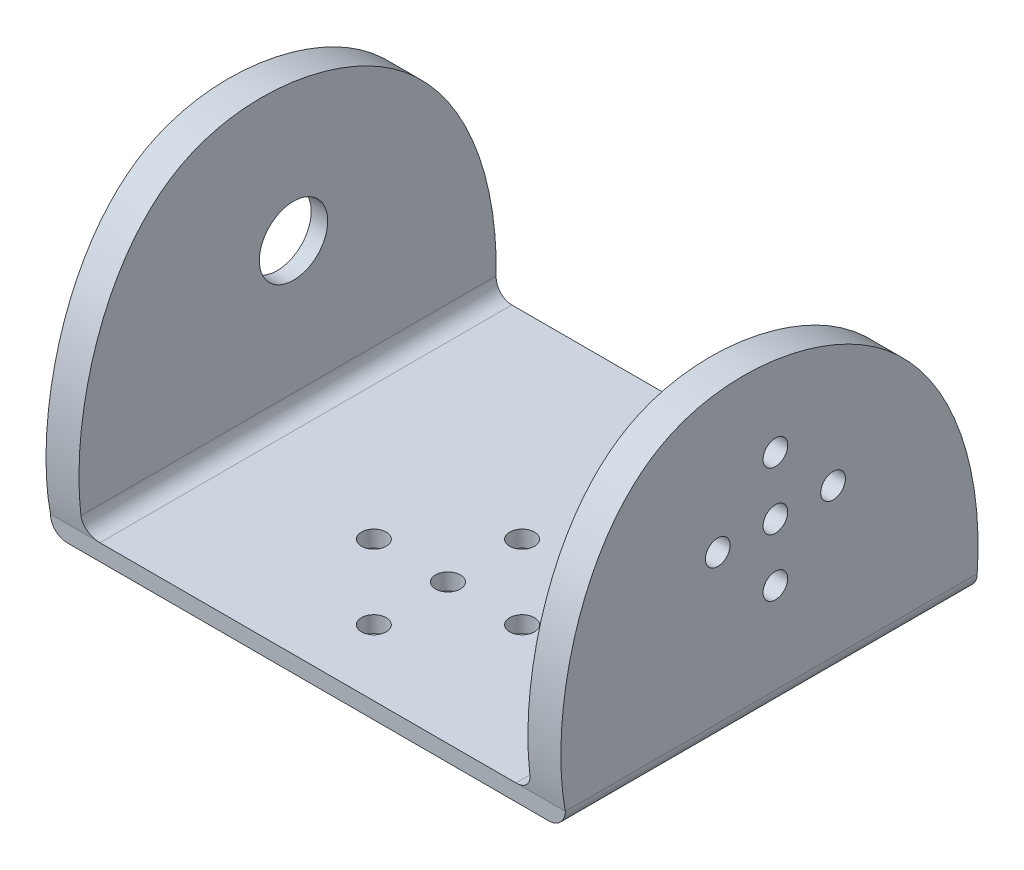
ISO-10303-21;
HEADER;
FILE_DESCRIPTION(('STEP AP214'),'2;1');
FILE_NAME('part.step','',(''),(''),'','','');
FILE_SCHEMA(('AUTOMOTIVE_DESIGN { 1 0 10303 214 1 1 1 1 }'));
ENDSEC;
DATA;
#1=APPLICATION_CONTEXT('core data for automotive mechanical design processes');
#2=APPLICATION_PROTOCOL_DEFINITION('international standard','automotive_design',2000,#1);
#3=PRODUCT_CONTEXT('',#1,'mechanical');
#4=PRODUCT('Part','Part','',(#3));
#5=PRODUCT_RELATED_PRODUCT_CATEGORY('part','',(#4));
#6=PRODUCT_DEFINITION_FORMATION('','',#4);
#7=PRODUCT_DEFINITION_CONTEXT('part definition',#1,'design');
#8=PRODUCT_DEFINITION('design','',#6,#7);
#9=PRODUCT_DEFINITION_SHAPE('','',#8);
#10=(LENGTH_UNIT() NAMED_UNIT(*) SI_UNIT(.MILLI.,.METRE.));
#11=(NAMED_UNIT(*) PLANE_ANGLE_UNIT() SI_UNIT($,.RADIAN.));
#12=(NAMED_UNIT(*) SI_UNIT($,.STERADIAN.) SOLID_ANGLE_UNIT());
#13=UNCERTAINTY_MEASURE_WITH_UNIT(LENGTH_MEASURE(1.E-05),#10,'distance_accuracy_value','');
#14=(GEOMETRIC_REPRESENTATION_CONTEXT(3) GLOBAL_UNCERTAINTY_ASSIGNED_CONTEXT((#13)) GLOBAL_UNIT_ASSIGNED_CONTEXT((#10,
#11,#12)) REPRESENTATION_CONTEXT('',''));
#15=CARTESIAN_POINT('',(0.,0.,0.));
#16=DIRECTION('',(0.,0.,1.));
#17=DIRECTION('',(1.,0.,0.));
#18=AXIS2_PLACEMENT_3D('',#15,#16,#17);
#19=CARTESIAN_POINT('',(-21.25,20.,-0.500000000000001));
#20=DIRECTION('',(-1.,0.,0.));
#21=DIRECTION('',(0.,0.,-1.));
#22=AXIS2_PLACEMENT_3D('',#19,#20,#21);
#23=CYLINDRICAL_SURFACE('',#22,4.15);
#24=CARTESIAN_POINT('',(-27.25,20.,-0.500000000000001));
#25=DIRECTION('',(1.,0.,0.));
#26=DIRECTION('',(0.,0.,-1.));
#27=AXIS2_PLACEMENT_3D('',#24,#25,#26);
#28=CIRCLE('',#27,4.15);
#29=CARTESIAN_POINT('',(-27.25,20.,-4.65));
#30=VERTEX_POINT('',#29);
#31=EDGE_CURVE('E344',#30,#30,#28,.T.);
#32=ORIENTED_EDGE('',*,*,#31,.T.);
#33=EDGE_LOOP('',(#32));
#34=FACE_BOUND('',#33,.T.);
#35=CARTESIAN_POINT('',(-29.25,20.,-0.500000000000001));
#36=DIRECTION('',(1.,0.,0.));
#37=DIRECTION('',(0.,0.,-1.));
#38=AXIS2_PLACEMENT_3D('',#35,#36,#37);
#39=CIRCLE('',#38,4.15);
#40=CARTESIAN_POINT('',(-29.25,20.,-4.65));
#41=VERTEX_POINT('',#40);
#42=EDGE_CURVE('E39',#41,#41,#39,.F.);
#43=ORIENTED_EDGE('',*,*,#42,.T.);
#44=EDGE_LOOP('',(#43));
#45=FACE_BOUND('',#44,.T.);
#46=ADVANCED_FACE('F35',(#34,#45),#23,.F.);
#47=CARTESIAN_POINT('',(0.,2.,0.));
#48=DIRECTION('',(0.,-1.,0.));
#49=DIRECTION('',(0.,0.,1.));
#50=AXIS2_PLACEMENT_3D('',#47,#48,#49);
#51=PLANE('',#50);
#52=CARTESIAN_POINT('',(0.,2.,8.));
#53=DIRECTION('',(0.,-1.,0.));
#54=DIRECTION('',(0.,0.,-1.));
#55=AXIS2_PLACEMENT_3D('',#52,#53,#54);
#56=CIRCLE('',#55,1.5);
#57=CARTESIAN_POINT('',(0.,2.,6.5));
#58=VERTEX_POINT('',#57);
#59=EDGE_CURVE('E345',#58,#58,#56,.T.);
#60=ORIENTED_EDGE('',*,*,#59,.T.);
#61=EDGE_LOOP('',(#60));
#62=FACE_BOUND('',#61,.T.);
#63=CARTESIAN_POINT('',(9.,2.,8.));
#64=DIRECTION('',(0.,-1.,0.));
#65=DIRECTION('',(0.,0.,-1.));
#66=AXIS2_PLACEMENT_3D('',#63,#64,#65);
#67=CIRCLE('',#66,1.49999999999999);
#68=CARTESIAN_POINT('',(9.,2.,6.50000000000001));
#69=VERTEX_POINT('',#68);
#70=EDGE_CURVE('E348',#69,#69,#67,.T.);
#71=ORIENTED_EDGE('',*,*,#70,.T.);
#72=EDGE_LOOP('',(#71));
#73=FACE_BOUND('',#72,.T.);
#74=CARTESIAN_POINT('',(-9.,2.,8.));
#75=DIRECTION('',(0.,-1.,0.));
#76=DIRECTION('',(0.,0.,-1.));
#77=AXIS2_PLACEMENT_3D('',#74,#75,#76);
#78=CIRCLE('',#77,1.5);
#79=CARTESIAN_POINT('',(-9.,2.,6.5));
#80=VERTEX_POINT('',#79);
#81=EDGE_CURVE('E362',#80,#80,#78,.T.);
#82=ORIENTED_EDGE('',*,*,#81,.T.);
#83=EDGE_LOOP('',(#82));
#84=FACE_BOUND('',#83,.T.);
#85=CARTESIAN_POINT('',(0.,2.,-0.999999999999999));
#86=DIRECTION('',(0.,-1.,0.));
#87=DIRECTION('',(0.,0.,-1.));
#88=AXIS2_PLACEMENT_3D('',#85,#86,#87);
#89=CIRCLE('',#88,1.5);
#90=CARTESIAN_POINT('',(0.,2.,-2.5));
#91=VERTEX_POINT('',#90);
#92=EDGE_CURVE('E336',#91,#91,#89,.T.);
#93=ORIENTED_EDGE('',*,*,#92,.T.);
#94=EDGE_LOOP('',(#93));
#95=FACE_BOUND('',#94,.T.);
#96=CARTESIAN_POINT('',(0.,2.,17.));
#97=DIRECTION('',(0.,-1.,0.));
#98=DIRECTION('',(0.,0.,-1.));
#99=AXIS2_PLACEMENT_3D('',#96,#97,#98);
#100=CIRCLE('',#99,1.5);
#101=CARTESIAN_POINT('',(0.,2.,15.5));
#102=VERTEX_POINT('',#101);
#103=EDGE_CURVE('E331',#102,#102,#100,.T.);
#104=ORIENTED_EDGE('',*,*,#103,.T.);
#105=EDGE_LOOP('',(#104));
#106=FACE_BOUND('',#105,.T.);
#107=DIRECTION('',(1.,0.,0.));
#108=VECTOR('',#107,1.);
#109=CARTESIAN_POINT('',(-31.25,2.,-25.));
#110=LINE('',#109,#108);
#111=CARTESIAN_POINT('',(-25.25,2.,-25.));
#112=VERTEX_POINT('',#111);
#113=CARTESIAN_POINT('',(25.25,2.,-25.));
#114=VERTEX_POINT('',#113);
#115=EDGE_CURVE('E123',#112,#114,#110,.T.);
#116=ORIENTED_EDGE('',*,*,#115,.F.);
#117=DIRECTION('',(0.,0.,1.));
#118=VECTOR('',#117,1.);
#119=CARTESIAN_POINT('',(-25.25,2.,-25.));
#120=LINE('',#119,#118);
#121=CARTESIAN_POINT('',(-25.25,2.,25.));
#122=VERTEX_POINT('',#121);
#123=EDGE_CURVE('E168',#122,#112,#120,.F.);
#124=ORIENTED_EDGE('',*,*,#123,.F.);
#125=DIRECTION('',(-1.,0.,0.));
#126=VECTOR('',#125,1.);
#127=CARTESIAN_POINT('',(-31.25,2.,25.));
#128=LINE('',#127,#126);
#129=CARTESIAN_POINT('',(25.25,2.,25.));
#130=VERTEX_POINT('',#129);
#131=EDGE_CURVE('E124',#130,#122,#128,.T.);
#132=ORIENTED_EDGE('',*,*,#131,.F.);
#133=DIRECTION('',(0.,0.,1.));
#134=VECTOR('',#133,1.);
#135=CARTESIAN_POINT('',(25.25,2.,25.));
#136=LINE('',#135,#134);
#137=EDGE_CURVE('E185',#114,#130,#136,.T.);
#138=ORIENTED_EDGE('',*,*,#137,.F.);
#139=EDGE_LOOP('',(#116,#124,#132,#138));
#140=FACE_BOUND('',#139,.T.);
#141=ADVANCED_FACE('F183',(#62,#73,#84,#95,#106,#140),#51,.F.);
#142=CARTESIAN_POINT('',(31.25,2.,-25.));
#143=DIRECTION('',(-1.,0.,0.));
#144=DIRECTION('',(0.,0.,-1.));
#145=AXIS2_PLACEMENT_3D('',#142,#143,#144);
#146=PLANE('',#145);
#147=CARTESIAN_POINT('',(31.25,20.,-7.5));
#148=DIRECTION('',(-1.,0.,0.));
#149=DIRECTION('',(0.,0.,1.));
#150=AXIS2_PLACEMENT_3D('',#147,#148,#149);
#151=CIRCLE('',#150,1.5);
#152=CARTESIAN_POINT('',(31.25,20.,-6.));
#153=VERTEX_POINT('',#152);
#154=EDGE_CURVE('E330',#153,#153,#151,.T.);
#155=ORIENTED_EDGE('',*,*,#154,.T.);
#156=EDGE_LOOP('',(#155));
#157=FACE_BOUND('',#156,.T.);
#158=CARTESIAN_POINT('',(31.25,13.,-0.500000000000003));
#159=DIRECTION('',(-1.,0.,0.));
#160=DIRECTION('',(0.,0.,1.));
#161=AXIS2_PLACEMENT_3D('',#158,#159,#160);
#162=CIRCLE('',#161,1.5);
#163=CARTESIAN_POINT('',(31.25,13.,0.999999999999998));
#164=VERTEX_POINT('',#163);
#165=EDGE_CURVE('E370',#164,#164,#162,.T.);
#166=ORIENTED_EDGE('',*,*,#165,.T.);
#167=EDGE_LOOP('',(#166));
#168=FACE_BOUND('',#167,.T.);
#169=CARTESIAN_POINT('',(31.25,20.,6.5));
#170=DIRECTION('',(-1.,0.,0.));
#171=DIRECTION('',(0.,0.,1.));
#172=AXIS2_PLACEMENT_3D('',#169,#170,#171);
#173=CIRCLE('',#172,1.5);
#174=CARTESIAN_POINT('',(31.25,20.,8.));
#175=VERTEX_POINT('',#174);
#176=EDGE_CURVE('E373',#175,#175,#173,.T.);
#177=ORIENTED_EDGE('',*,*,#176,.T.);
#178=EDGE_LOOP('',(#177));
#179=FACE_BOUND('',#178,.T.);
#180=CARTESIAN_POINT('',(31.25,27.,-0.500000000000001));
#181=DIRECTION('',(-1.,0.,0.));
#182=DIRECTION('',(0.,0.,1.));
#183=AXIS2_PLACEMENT_3D('',#180,#181,#182);
#184=CIRCLE('',#183,1.5);
#185=CARTESIAN_POINT('',(31.25,27.,1.));
#186=VERTEX_POINT('',#185);
#187=EDGE_CURVE('E319',#186,#186,#184,.T.);
#188=ORIENTED_EDGE('',*,*,#187,.T.);
#189=EDGE_LOOP('',(#188));
#190=FACE_BOUND('',#189,.T.);
#191=CARTESIAN_POINT('',(31.25,20.,-0.500000000000001));
#192=DIRECTION('',(-1.,0.,0.));
#193=DIRECTION('',(0.,0.,1.));
#194=AXIS2_PLACEMENT_3D('',#191,#192,#193);
#195=CIRCLE('',#194,1.5);
#196=CARTESIAN_POINT('',(31.25,20.,1.));
#197=VERTEX_POINT('',#196);
#198=EDGE_CURVE('E201',#197,#197,#195,.T.);
#199=ORIENTED_EDGE('',*,*,#198,.T.);
#200=EDGE_LOOP('',(#199));
#201=FACE_BOUND('',#200,.T.);
#202=CARTESIAN_POINT('',(31.25,2.,25.));
#203=CARTESIAN_POINT('',(31.25,12.4965732747721,26.9986110399996));
#204=CARTESIAN_POINT('',(31.25,40.5213350472176,21.2250504115053));
#205=CARTESIAN_POINT('',(31.25,35.4925410191959,-18.9148455529088));
#206=CARTESIAN_POINT('',(31.25,13.3222401499654,-25.8185226715894));
#207=CARTESIAN_POINT('',(31.25,2.,-25.));
#208=B_SPLINE_CURVE_WITH_KNOTS('',3,(#202,#203,#204,#205,#206,#207),.UNSPECIFIED.,.F.,.F.,(4,1,
1,4),(0.,0.374548065901029,0.638867123115129,1.),.UNSPECIFIED.);
#209=CARTESIAN_POINT('',(31.25,2.,25.));
#210=VERTEX_POINT('',#209);
#211=CARTESIAN_POINT('',(31.25,2.,-25.));
#212=VERTEX_POINT('',#211);
#213=EDGE_CURVE('E119',#210,#212,#208,.T.);
#214=ORIENTED_EDGE('',*,*,#213,.F.);
#215=DIRECTION('',(0.,0.,1.));
#216=VECTOR('',#215,1.);
#217=CARTESIAN_POINT('',(31.25,2.,25.));
#218=LINE('',#217,#216);
#219=EDGE_CURVE('E127',#212,#210,#218,.T.);
#220=ORIENTED_EDGE('',*,*,#219,.F.);
#221=EDGE_LOOP('',(#214,#220));
#222=FACE_BOUND('',#221,.T.);
#223=ADVANCED_FACE('F133',(#157,#168,#179,#190,#201,#222),#146,.F.);
#224=CARTESIAN_POINT('',(-31.25,2.,25.));
#225=DIRECTION('',(0.,0.,-1.));
#226=DIRECTION('',(1.,0.,0.));
#227=AXIS2_PLACEMENT_3D('',#224,#225,#226);
#228=PLANE('',#227);
#229=EDGE_CURVE('E107',#210,#130,#128,.T.);
#230=ORIENTED_EDGE('',*,*,#229,.T.);
#231=ORIENTED_EDGE('',*,*,#131,.T.);
#232=DIRECTION('',(-1.,0.,0.));
#233=VECTOR('',#232,1.);
#234=CARTESIAN_POINT('',(-27.25,2.,25.));
#235=LINE('',#234,#233);
#236=CARTESIAN_POINT('',(-31.25,2.,25.));
#237=VERTEX_POINT('',#236);
#238=EDGE_CURVE('E135',#122,#237,#235,.T.);
#239=ORIENTED_EDGE('',*,*,#238,.T.);
#240=CARTESIAN_POINT('',(-29.25,2.,25.));
#241=DIRECTION('',(0.,0.,1.));
#242=DIRECTION('',(1.,0.,0.));
#243=AXIS2_PLACEMENT_3D('',#240,#241,#242);
#244=CIRCLE('',#243,2.);
#245=CARTESIAN_POINT('',(-29.25,0.,25.));
#246=VERTEX_POINT('',#245);
#247=EDGE_CURVE('E112',#246,#237,#244,.F.);
#248=ORIENTED_EDGE('',*,*,#247,.F.);
#249=DIRECTION('',(-1.,0.,0.));
#250=VECTOR('',#249,1.);
#251=CARTESIAN_POINT('',(-31.25,0.,25.));
#252=LINE('',#251,#250);
#253=CARTESIAN_POINT('',(29.25,0.,25.));
#254=VERTEX_POINT('',#253);
#255=EDGE_CURVE('E110',#254,#246,#252,.T.);
#256=ORIENTED_EDGE('',*,*,#255,.F.);
#257=CARTESIAN_POINT('',(29.25,2.,25.));
#258=DIRECTION('',(0.,0.,1.));
#259=DIRECTION('',(1.,0.,0.));
#260=AXIS2_PLACEMENT_3D('',#257,#258,#259);
#261=CIRCLE('',#260,2.);
#262=EDGE_CURVE('E103',#210,#254,#261,.F.);
#263=ORIENTED_EDGE('',*,*,#262,.F.);
#264=EDGE_LOOP('',(#230,#231,#239,#248,#256,#263));
#265=FACE_BOUND('',#264,.T.);
#266=ADVANCED_FACE('F105',(#265),#228,.F.);
#267=CARTESIAN_POINT('',(-31.25,2.,-25.));
#268=DIRECTION('',(1.,0.,0.));
#269=DIRECTION('',(0.,0.,1.));
#270=AXIS2_PLACEMENT_3D('',#267,#268,#269);
#271=PLANE('',#270);
#272=CARTESIAN_POINT('',(-31.25,20.,-0.500000000000001));
#273=DIRECTION('',(1.,0.,0.));
#274=DIRECTION('',(0.,0.,-1.));
#275=AXIS2_PLACEMENT_3D('',#272,#273,#274);
#276=CIRCLE('',#275,8.);
#277=CARTESIAN_POINT('',(-31.25,20.,-8.5));
#278=VERTEX_POINT('',#277);
#279=EDGE_CURVE('E354',#278,#278,#276,.T.);
#280=ORIENTED_EDGE('',*,*,#279,.T.);
#281=EDGE_LOOP('',(#280));
#282=FACE_BOUND('',#281,.T.);
#283=CARTESIAN_POINT('',(-31.25,2.,25.));
#284=CARTESIAN_POINT('',(-31.25,12.4965732747721,26.9986110399996));
#285=CARTESIAN_POINT('',(-31.25,40.5213350472176,21.2250504115053));
#286=CARTESIAN_POINT('',(-31.25,35.4925410191959,-18.9148455529088));
#287=CARTESIAN_POINT('',(-31.25,13.3222401499654,-25.8185226715894));
#288=CARTESIAN_POINT('',(-31.25,2.,-25.));
#289=B_SPLINE_CURVE_WITH_KNOTS('',3,(#283,#284,#285,#286,#287,#288),.UNSPECIFIED.,.F.,.F.,(4,1,
1,4),(0.,0.374548065901029,0.638867123115129,1.),.UNSPECIFIED.);
#290=CARTESIAN_POINT('',(-31.25,2.,-25.));
#291=VERTEX_POINT('',#290);
#292=EDGE_CURVE('E195',#237,#291,#289,.T.);
#293=ORIENTED_EDGE('',*,*,#292,.T.);
#294=DIRECTION('',(0.,0.,-1.));
#295=VECTOR('',#294,1.);
#296=CARTESIAN_POINT('',(-31.25,2.,-25.));
#297=LINE('',#296,#295);
#298=EDGE_CURVE('E11',#237,#291,#297,.T.);
#299=ORIENTED_EDGE('',*,*,#298,.F.);
#300=EDGE_LOOP('',(#293,#299));
#301=FACE_BOUND('',#300,.T.);
#302=ADVANCED_FACE('F407',(#282,#301),#271,.F.);
#303=CARTESIAN_POINT('',(-31.25,2.,-25.));
#304=DIRECTION('',(0.,0.,1.));
#305=DIRECTION('',(-1.,0.,0.));
#306=AXIS2_PLACEMENT_3D('',#303,#304,#305);
#307=PLANE('',#306);
#308=DIRECTION('',(1.,0.,0.));
#309=VECTOR('',#308,1.);
#310=CARTESIAN_POINT('',(-31.25,0.,-25.));
#311=LINE('',#310,#309);
#312=CARTESIAN_POINT('',(-29.25,0.,-25.));
#313=VERTEX_POINT('',#312);
#314=CARTESIAN_POINT('',(29.25,0.,-25.));
#315=VERTEX_POINT('',#314);
#316=EDGE_CURVE('E164',#313,#315,#311,.T.);
#317=ORIENTED_EDGE('',*,*,#316,.F.);
#318=CARTESIAN_POINT('',(-29.25,2.,-25.));
#319=DIRECTION('',(0.,0.,-1.));
#320=DIRECTION('',(-1.,0.,0.));
#321=AXIS2_PLACEMENT_3D('',#318,#319,#320);
#322=CIRCLE('',#321,2.);
#323=EDGE_CURVE('E563',#291,#313,#322,.F.);
#324=ORIENTED_EDGE('',*,*,#323,.F.);
#325=EDGE_CURVE('E165',#291,#112,#110,.T.);
#326=ORIENTED_EDGE('',*,*,#325,.T.);
#327=ORIENTED_EDGE('',*,*,#115,.T.);
#328=DIRECTION('',(1.,0.,0.));
#329=VECTOR('',#328,1.);
#330=CARTESIAN_POINT('',(27.25,2.,-25.));
#331=LINE('',#330,#329);
#332=EDGE_CURVE('E138',#114,#212,#331,.T.);
#333=ORIENTED_EDGE('',*,*,#332,.T.);
#334=CARTESIAN_POINT('',(29.25,2.,-25.));
#335=DIRECTION('',(0.,0.,-1.));
#336=DIRECTION('',(-1.,0.,0.));
#337=AXIS2_PLACEMENT_3D('',#334,#335,#336);
#338=CIRCLE('',#337,2.);
#339=EDGE_CURVE('E44',#315,#212,#338,.F.);
#340=ORIENTED_EDGE('',*,*,#339,.F.);
#341=EDGE_LOOP('',(#317,#324,#326,#327,#333,#340));
#342=FACE_BOUND('',#341,.T.);
#343=ADVANCED_FACE('F177',(#342),#307,.F.);
#344=CARTESIAN_POINT('',(0.,0.,0.));
#345=DIRECTION('',(0.,-1.,0.));
#346=DIRECTION('',(0.,0.,1.));
#347=AXIS2_PLACEMENT_3D('',#344,#345,#346);
#348=PLANE('',#347);
#349=CARTESIAN_POINT('',(0.,0.,8.));
#350=DIRECTION('',(0.,1.,0.));
#351=DIRECTION('',(0.,0.,1.));
#352=AXIS2_PLACEMENT_3D('',#349,#350,#351);
#353=CIRCLE('',#352,1.5);
#354=CARTESIAN_POINT('',(0.,0.,9.5));
#355=VERTEX_POINT('',#354);
#356=EDGE_CURVE('E342',#355,#355,#353,.T.);
#357=ORIENTED_EDGE('',*,*,#356,.T.);
#358=EDGE_LOOP('',(#357));
#359=FACE_BOUND('',#358,.T.);
#360=CARTESIAN_POINT('',(9.,0.,8.));
#361=DIRECTION('',(0.,1.,0.));
#362=DIRECTION('',(0.,0.,1.));
#363=AXIS2_PLACEMENT_3D('',#360,#361,#362);
#364=CIRCLE('',#363,1.49999999999999);
#365=CARTESIAN_POINT('',(9.,0.,9.49999999999999));
#366=VERTEX_POINT('',#365);
#367=EDGE_CURVE('E339',#366,#366,#364,.T.);
#368=ORIENTED_EDGE('',*,*,#367,.T.);
#369=EDGE_LOOP('',(#368));
#370=FACE_BOUND('',#369,.T.);
#371=CARTESIAN_POINT('',(-9.,0.,8.));
#372=DIRECTION('',(0.,1.,0.));
#373=DIRECTION('',(0.,0.,1.));
#374=AXIS2_PLACEMENT_3D('',#371,#372,#373);
#375=CIRCLE('',#374,1.5);
#376=CARTESIAN_POINT('',(-9.,0.,9.5));
#377=VERTEX_POINT('',#376);
#378=EDGE_CURVE('E335',#377,#377,#375,.T.);
#379=ORIENTED_EDGE('',*,*,#378,.T.);
#380=EDGE_LOOP('',(#379));
#381=FACE_BOUND('',#380,.T.);
#382=CARTESIAN_POINT('',(0.,0.,-0.999999999999999));
#383=DIRECTION('',(0.,1.,0.));
#384=DIRECTION('',(0.,0.,1.));
#385=AXIS2_PLACEMENT_3D('',#382,#383,#384);
#386=CIRCLE('',#385,1.5);
#387=CARTESIAN_POINT('',(0.,0.,0.500000000000002));
#388=VERTEX_POINT('',#387);
#389=EDGE_CURVE('E332',#388,#388,#386,.T.);
#390=ORIENTED_EDGE('',*,*,#389,.T.);
#391=EDGE_LOOP('',(#390));
#392=FACE_BOUND('',#391,.T.);
#393=CARTESIAN_POINT('',(0.,0.,17.));
#394=DIRECTION('',(0.,1.,0.));
#395=DIRECTION('',(0.,0.,1.));
#396=AXIS2_PLACEMENT_3D('',#393,#394,#395);
#397=CIRCLE('',#396,1.5);
#398=CARTESIAN_POINT('',(0.,0.,18.5));
#399=VERTEX_POINT('',#398);
#400=EDGE_CURVE('E327',#399,#399,#397,.T.);
#401=ORIENTED_EDGE('',*,*,#400,.T.);
#402=EDGE_LOOP('',(#401));
#403=FACE_BOUND('',#402,.T.);
#404=ORIENTED_EDGE('',*,*,#255,.T.);
#405=DIRECTION('',(0.,0.,-1.));
#406=VECTOR('',#405,1.);
#407=CARTESIAN_POINT('',(-29.25,0.,25.));
#408=LINE('',#407,#406);
#409=EDGE_CURVE('E60',#313,#246,#408,.F.);
#410=ORIENTED_EDGE('',*,*,#409,.F.);
#411=ORIENTED_EDGE('',*,*,#316,.T.);
#412=DIRECTION('',(0.,0.,1.));
#413=VECTOR('',#412,1.);
#414=CARTESIAN_POINT('',(29.25,0.,-25.));
#415=LINE('',#414,#413);
#416=EDGE_CURVE('E52',#254,#315,#415,.F.);
#417=ORIENTED_EDGE('',*,*,#416,.F.);
#418=EDGE_LOOP('',(#404,#410,#411,#417));
#419=FACE_BOUND('',#418,.T.);
#420=ADVANCED_FACE('F399',(#359,#370,#381,#392,#403,#419),#348,.T.);
#421=CARTESIAN_POINT('',(27.25,2.,25.));
#422=CARTESIAN_POINT('',(27.25,12.4965732747721,26.9986110399996));
#423=CARTESIAN_POINT('',(27.25,40.5213350472176,21.2250504115053));
#424=CARTESIAN_POINT('',(27.25,35.4925410191959,-18.9148455529088));
#425=CARTESIAN_POINT('',(27.25,13.3222401499654,-25.8185226715894));
#426=CARTESIAN_POINT('',(27.25,2.,-25.));
#427=B_SPLINE_CURVE_WITH_KNOTS('',3,(#421,#422,#423,#424,#425,#426),.UNSPECIFIED.,.F.,.F.,(4,1,
1,4),(0.,0.374548065901029,0.638867123115129,1.),.UNSPECIFIED.);
#428=DIRECTION('',(1.,0.,0.));
#429=VECTOR('',#428,1.);
#430=SURFACE_OF_LINEAR_EXTRUSION('',#427,#429);
#431=ORIENTED_EDGE('',*,*,#213,.T.);
#432=ORIENTED_EDGE('',*,*,#332,.F.);
#433=CARTESIAN_POINT('',(27.25,4.,-25.0940546730837));
#434=CARTESIAN_POINT('',(27.2499996602988,3.94371790823869,-25.0928174416989));
#435=CARTESIAN_POINT('',(27.2476227621191,3.88746553850568,-25.0914613576098));
#436=CARTESIAN_POINT('',(27.2381418971551,3.77536969388625,-25.0885258744203));
#437=CARTESIAN_POINT('',(27.2310381975837,3.71952619606613,-25.0869464879476));
#438=CARTESIAN_POINT('',(27.2027078619535,3.55331307572943,-25.0819004804104));
#439=CARTESIAN_POINT('',(27.1744617833224,3.44406617622991,-25.078121685189));
#440=CARTESIAN_POINT('',(27.1000463326179,3.23189133924249,-25.0699548927492));
#441=CARTESIAN_POINT('',(27.053869078434,3.12896620372471,-25.0655666281684));
#442=CARTESIAN_POINT('',(26.9449088923315,2.93233507965083,-25.0564824892471));
#443=CARTESIAN_POINT('',(26.8821284340264,2.83862772064333,-25.0517866608071));
#444=CARTESIAN_POINT('',(26.7416617335216,2.66298579810713,-25.0424357746962));
#445=CARTESIAN_POINT('',(26.6639600176479,2.58106361168521,-25.0377807646413));
#446=CARTESIAN_POINT('',(26.4958669885989,2.4314089330096,-25.028888436805));
#447=CARTESIAN_POINT('',(26.4054732527391,2.36367915600468,-25.0246511990325));
#448=CARTESIAN_POINT('',(26.2145672147693,2.24435557040868,-25.0169492732739));
#449=CARTESIAN_POINT('',(26.1140539741217,2.19276326031955,-25.0134846570408));
#450=CARTESIAN_POINT('',(25.9057806617175,2.10722286137904,-25.007628227467));
#451=CARTESIAN_POINT('',(25.7980250552955,2.0732640111762,-25.0052357599376));
#452=CARTESIAN_POINT('',(25.6163340698651,2.03245270329474,-25.0023359820987));
#453=CARTESIAN_POINT('',(25.543552911349,2.02029080201167,-25.0014630757466));
#454=CARTESIAN_POINT('',(25.397191542896,2.00406531086475,-25.000293924171));
#455=CARTESIAN_POINT('',(25.3236125836537,1.99999049273825,-24.9999968794234));
#456=CARTESIAN_POINT('',(25.25,2.,-25.));
#457=B_SPLINE_CURVE_WITH_KNOTS('',3,(#433,#434,#435,#436,#437,#438,#439,#440,#441,#442,#443,
#444,#445,#446,#447,#448,#449,#450,#451,#452,#453,#454,#455,#456),.UNSPECIFIED.,.F.,.F.,(4,2,2,
2,2,2,2,2,2,2,2,4),(0.,0.168783026130116,0.337556511523385,0.674526832554655,1.01164544556335,
1.34871386152227,1.68613373117391,2.02361809615281,2.36113379014715,2.69844326219136,
2.91940936905553,3.14006846707721),.UNSPECIFIED.);
#458=CARTESIAN_POINT('',(27.25,3.99999999999898,-25.0940546730837));
#459=VERTEX_POINT('',#458);
#460=EDGE_CURVE('E390',#459,#114,#457,.T.);
#461=ORIENTED_EDGE('',*,*,#460,.F.);
#462=CARTESIAN_POINT('',(27.25,3.99999999999718,25.3073145724767));
#463=VERTEX_POINT('',#462);
#464=EDGE_CURVE('E134',#463,#459,#427,.T.);
#465=ORIENTED_EDGE('',*,*,#464,.F.);
#466=CARTESIAN_POINT('',(25.25,2.,25.));
#467=CARTESIAN_POINT('',(25.3056308472885,1.99999982456958,24.9999989302493));
#468=CARTESIAN_POINT('',(25.3612346927238,2.00232258138537,25.0004423444697));
#469=CARTESIAN_POINT('',(25.4720371476397,2.0115853624888,25.0022039069439));
#470=CARTESIAN_POINT('',(25.5272357954518,2.0185249441836,25.0035219713493));
#471=CARTESIAN_POINT('',(25.6914675227234,2.04618532801374,25.0087590872627));
#472=CARTESIAN_POINT('',(25.7993887718549,2.07374806845775,25.0139611924871));
#473=CARTESIAN_POINT('',(26.0089696358096,2.14627861323213,25.0274582520252));
#474=CARTESIAN_POINT('',(26.1106276831846,2.1912507541476,25.0357539769236));
#475=CARTESIAN_POINT('',(26.3049364192619,2.29725182035756,25.0549305356204));
#476=CARTESIAN_POINT('',(26.3975869850039,2.35828096480246,25.0658114047014));
#477=CARTESIAN_POINT('',(26.5722023950081,2.49526999989428,25.0896467580208));
#478=CARTESIAN_POINT('',(26.6540598744528,2.57136343945371,25.1026195819123));
#479=CARTESIAN_POINT('',(26.8039134794138,2.73598106119919,25.1298738261535));
#480=CARTESIAN_POINT('',(26.8719062758284,2.82450822029571,25.1441555596));
#481=CARTESIAN_POINT('',(26.9931070428983,3.01292659727219,25.1735476861525));
#482=CARTESIAN_POINT('',(27.0460814910199,3.1129665153829,25.1886672106529));
#483=CARTESIAN_POINT('',(27.1344136154236,3.32052278078583,25.2188616726429));
#484=CARTESIAN_POINT('',(27.1697804084676,3.42803522607575,25.2339366291807));
#485=CARTESIAN_POINT('',(27.2138203997309,3.61339235163513,25.2588681236007));
#486=CARTESIAN_POINT('',(27.2273711970838,3.69009171347356,25.268892509345));
#487=CARTESIAN_POINT('',(27.2454614467239,3.84450441001522,25.2884807891499));
#488=CARTESIAN_POINT('',(27.250012134452,3.9222163584259,25.298045242795));
#489=CARTESIAN_POINT('',(27.25,3.99999999999996,25.307314572477));
#490=B_SPLINE_CURVE_WITH_KNOTS('',3,(#466,#467,#468,#469,#470,#471,#472,#473,#474,#475,#476,
#477,#478,#479,#480,#481,#482,#483,#484,#485,#486,#487,#488,#489),.UNSPECIFIED.,.F.,.F.,(4,2,2,
2,2,2,2,2,2,2,2,4),(0.,0.166788867778222,0.333561748611818,0.666360093928348,0.999241390864281,
1.33212723129139,1.66810821952952,2.00416978669031,2.34520134302898,2.68605613844457,
2.92115037932767,3.155950950578),.UNSPECIFIED.);
#491=EDGE_CURVE('E122',#130,#463,#490,.T.);
#492=ORIENTED_EDGE('',*,*,#491,.F.);
#493=ORIENTED_EDGE('',*,*,#229,.F.);
#494=EDGE_LOOP('',(#431,#432,#461,#465,#492,#493));
#495=FACE_BOUND('',#494,.T.);
#496=ADVANCED_FACE('F116',(#495),#430,.F.);
#497=CARTESIAN_POINT('',(27.25,36.9357221086631,1.54790967486696));
#498=DIRECTION('',(1.,0.,0.));
#499=DIRECTION('',(0.,0.,1.));
#500=AXIS2_PLACEMENT_3D('',#497,#498,#499);
#501=PLANE('',#500);
#502=CARTESIAN_POINT('',(27.25,20.,-7.5));
#503=DIRECTION('',(-1.,0.,0.));
#504=DIRECTION('',(0.,0.,1.));
#505=AXIS2_PLACEMENT_3D('',#502,#503,#504);
#506=CIRCLE('',#505,1.5);
#507=CARTESIAN_POINT('',(27.25,20.,-6.));
#508=VERTEX_POINT('',#507);
#509=EDGE_CURVE('E312',#508,#508,#506,.T.);
#510=ORIENTED_EDGE('',*,*,#509,.F.);
#511=EDGE_LOOP('',(#510));
#512=FACE_BOUND('',#511,.T.);
#513=CARTESIAN_POINT('',(27.25,13.,-0.500000000000003));
#514=DIRECTION('',(-1.,0.,0.));
#515=DIRECTION('',(0.,0.,1.));
#516=AXIS2_PLACEMENT_3D('',#513,#514,#515);
#517=CIRCLE('',#516,1.5);
#518=CARTESIAN_POINT('',(27.25,13.,0.999999999999998));
#519=VERTEX_POINT('',#518);
#520=EDGE_CURVE('E322',#519,#519,#517,.T.);
#521=ORIENTED_EDGE('',*,*,#520,.F.);
#522=EDGE_LOOP('',(#521));
#523=FACE_BOUND('',#522,.T.);
#524=CARTESIAN_POINT('',(27.25,20.,6.5));
#525=DIRECTION('',(-1.,0.,0.));
#526=DIRECTION('',(0.,0.,1.));
#527=AXIS2_PLACEMENT_3D('',#524,#525,#526);
#528=CIRCLE('',#527,1.5);
#529=CARTESIAN_POINT('',(27.25,20.,8.));
#530=VERTEX_POINT('',#529);
#531=EDGE_CURVE('E318',#530,#530,#528,.T.);
#532=ORIENTED_EDGE('',*,*,#531,.F.);
#533=EDGE_LOOP('',(#532));
#534=FACE_BOUND('',#533,.T.);
#535=CARTESIAN_POINT('',(27.25,27.,-0.500000000000001));
#536=DIRECTION('',(-1.,0.,0.));
#537=DIRECTION('',(0.,0.,1.));
#538=AXIS2_PLACEMENT_3D('',#535,#536,#537);
#539=CIRCLE('',#538,1.5);
#540=CARTESIAN_POINT('',(27.25,27.,1.));
#541=VERTEX_POINT('',#540);
#542=EDGE_CURVE('E315',#541,#541,#539,.T.);
#543=ORIENTED_EDGE('',*,*,#542,.F.);
#544=EDGE_LOOP('',(#543));
#545=FACE_BOUND('',#544,.T.);
#546=CARTESIAN_POINT('',(27.25,20.,-0.500000000000001));
#547=DIRECTION('',(-1.,0.,0.));
#548=DIRECTION('',(0.,0.,1.));
#549=AXIS2_PLACEMENT_3D('',#546,#547,#548);
#550=CIRCLE('',#549,1.5);
#551=CARTESIAN_POINT('',(27.25,20.,1.));
#552=VERTEX_POINT('',#551);
#553=EDGE_CURVE('E308',#552,#552,#550,.T.);
#554=ORIENTED_EDGE('',*,*,#553,.F.);
#555=EDGE_LOOP('',(#554));
#556=FACE_BOUND('',#555,.T.);
#557=ORIENTED_EDGE('',*,*,#464,.T.);
#558=DIRECTION('',(0.,0.,1.));
#559=VECTOR('',#558,1.);
#560=CARTESIAN_POINT('',(27.25,4.,-25.));
#561=LINE('',#560,#559);
#562=EDGE_CURVE('E187',#463,#459,#561,.F.);
#563=ORIENTED_EDGE('',*,*,#562,.F.);
#564=EDGE_LOOP('',(#557,#563));
#565=FACE_BOUND('',#564,.T.);
#566=ADVANCED_FACE('F216',(#512,#523,#534,#545,#556,#565),#501,.F.);
#567=CARTESIAN_POINT('',(-27.25,2.,25.));
#568=CARTESIAN_POINT('',(-27.25,12.4965732747721,26.9986110399996));
#569=CARTESIAN_POINT('',(-27.25,40.5213350472176,21.2250504115053));
#570=CARTESIAN_POINT('',(-27.25,35.4925410191959,-18.9148455529088));
#571=CARTESIAN_POINT('',(-27.25,13.3222401499654,-25.8185226715894));
#572=CARTESIAN_POINT('',(-27.25,2.,-25.));
#573=B_SPLINE_CURVE_WITH_KNOTS('',3,(#567,#568,#569,#570,#571,#572),.UNSPECIFIED.,.F.,.F.,(4,1,
1,4),(0.,0.374548065901029,0.638867123115129,1.),.UNSPECIFIED.);
#574=DIRECTION('',(-1.,0.,0.));
#575=VECTOR('',#574,1.);
#576=SURFACE_OF_LINEAR_EXTRUSION('',#573,#575);
#577=ORIENTED_EDGE('',*,*,#292,.F.);
#578=ORIENTED_EDGE('',*,*,#238,.F.);
#579=CARTESIAN_POINT('',(-27.25,4.,25.3073145724767));
#580=CARTESIAN_POINT('',(-27.2499995002997,3.9432188202566,25.3005454568416));
#581=CARTESIAN_POINT('',(-27.2475804814018,3.88648416921429,25.2936232287081));
#582=CARTESIAN_POINT('',(-27.2379386596122,3.77346116439942,25.2795202145534));
#583=CARTESIAN_POINT('',(-27.2307162121404,3.71717277791824,25.2723394476993));
#584=CARTESIAN_POINT('',(-27.2019249077835,3.54967943743015,25.2505034412767));
#585=CARTESIAN_POINT('',(-27.1732318418591,3.43965579157005,25.2355317458476));
#586=CARTESIAN_POINT('',(-27.0976797601208,3.22609321823963,25.2053199420493));
#587=CARTESIAN_POINT('',(-27.0508142436986,3.12255662671628,25.1900797394947));
#588=CARTESIAN_POINT('',(-26.9402284204148,2.92484993903057,25.1599807106084));
#589=CARTESIAN_POINT('',(-26.8765101872144,2.8306786924592,25.1451218376022));
#590=CARTESIAN_POINT('',(-26.7338823557517,2.65427493583318,25.1164887617195));
#591=CARTESIAN_POINT('',(-26.6549557590029,2.57205596703485,25.1027157970739));
#592=CARTESIAN_POINT('',(-26.4841063330172,2.42205792844871,25.0770133301472));
#593=CARTESIAN_POINT('',(-26.3921814667145,2.35428112619353,25.0650841174302));
#594=CARTESIAN_POINT('',(-26.1987496339054,2.23573237380891,25.0438665160381));
#595=CARTESIAN_POINT('',(-26.0973288031976,2.18482356430833,25.0345569706041));
#596=CARTESIAN_POINT('',(-25.8871694049093,2.10084404547307,25.0190362384581));
#597=CARTESIAN_POINT('',(-25.7784368389628,2.06775890234706,25.0128225450002));
#598=CARTESIAN_POINT('',(-25.5990879110527,2.02944853506958,25.0055942513628));
#599=CARTESIAN_POINT('',(-25.5297022313551,2.01841319509346,25.0035011054154));
#600=CARTESIAN_POINT('',(-25.3902220182764,2.00368992081983,25.000702651112));
#601=CARTESIAN_POINT('',(-25.3201285536048,1.99999220780713,24.9999954956885));
#602=CARTESIAN_POINT('',(-25.25,2.,25.));
#603=B_SPLINE_CURVE_WITH_KNOTS('',3,(#579,#580,#581,#582,#583,#584,#585,#586,#587,#588,#589,
#590,#591,#592,#593,#594,#595,#596,#597,#598,#599,#600,#601,#602),.UNSPECIFIED.,.F.,.F.,(4,2,2,
2,2,2,2,2,2,2,2,4),(0.,0.171443016861837,0.342873349561651,0.685165765921442,1.02758073948382,
1.36995359979932,1.71271137576664,2.05552292778561,2.39548076168655,2.73516287875798,
2.94566014372603,3.15587669410919),.UNSPECIFIED.);
#604=CARTESIAN_POINT('',(-27.25,3.99999999999718,25.3073145724767));
#605=VERTEX_POINT('',#604);
#606=EDGE_CURVE('E222',#605,#122,#603,.T.);
#607=ORIENTED_EDGE('',*,*,#606,.F.);
#608=CARTESIAN_POINT('',(-27.25,3.99999999999902,-25.0940546730837));
#609=VERTEX_POINT('',#608);
#610=EDGE_CURVE('E141',#605,#609,#573,.T.);
#611=ORIENTED_EDGE('',*,*,#610,.T.);
#612=CARTESIAN_POINT('',(-25.25,2.,-25.));
#613=CARTESIAN_POINT('',(-25.306183866871,2.00000028946752,-24.9999993255992));
#614=CARTESIAN_POINT('',(-25.3623407565232,2.00236895897048,-25.0001713375267));
#615=CARTESIAN_POINT('',(-25.4742514226067,2.01181798663403,-25.0008529991588));
#616=CARTESIAN_POINT('',(-25.5300052215649,2.01889807940492,-25.0013626298457));
#617=CARTESIAN_POINT('',(-25.6959541835105,2.04713534341397,-25.0033840200909));
#618=CARTESIAN_POINT('',(-25.8050357601797,2.07528970437356,-25.0053883315066));
#619=CARTESIAN_POINT('',(-26.0169061052239,2.1494659694081,-25.0105376635655));
#620=CARTESIAN_POINT('',(-26.119692079986,2.1954957399705,-25.0136831863851));
#621=CARTESIAN_POINT('',(-26.316076792718,2.3041044437466,-25.0208431856252));
#622=CARTESIAN_POINT('',(-26.4096768294993,2.36668103274916,-25.0248575389426));
#623=CARTESIAN_POINT('',(-26.5851889418282,2.50671620674585,-25.0334251255028));
#624=CARTESIAN_POINT('',(-26.6670830904327,2.58419720028724,-25.0379791661481));
#625=CARTESIAN_POINT('',(-26.8167298948204,2.75180954361902,-25.0472530395619));
#626=CARTESIAN_POINT('',(-26.8844797121952,2.84194342646572,-25.0519729053858));
#627=CARTESIAN_POINT('',(-27.0040167794761,3.03247627853211,-25.0612230467341));
#628=CARTESIAN_POINT('',(-27.0557735543223,3.13289436583473,-25.0657529462571));
#629=CARTESIAN_POINT('',(-27.1416574740436,3.34099822997071,-25.0742895709472));
#630=CARTESIAN_POINT('',(-27.1757950534668,3.44867966243442,-25.0782966047161));
#631=CARTESIAN_POINT('',(-27.2170406156715,3.63084155386311,-25.0843061606053));
#632=CARTESIAN_POINT('',(-27.2293915720019,3.70417058495395,-25.0865271513332));
#633=CARTESIAN_POINT('',(-27.2458705063414,3.85165445091135,-25.0905867081509));
#634=CARTESIAN_POINT('',(-27.2500098043537,3.92580800704644,-25.0924257975648));
#635=CARTESIAN_POINT('',(-27.25,4.,-25.0940546730837));
#636=B_SPLINE_CURVE_WITH_KNOTS('',3,(#612,#613,#614,#615,#616,#617,#618,#619,#620,#621,#622,
#623,#624,#625,#626,#627,#628,#629,#630,#631,#632,#633,#634,#635),.UNSPECIFIED.,.F.,.F.,(4,2,2,
2,2,2,2,2,2,2,2,4),(0.,0.168447872528492,0.336886257361851,0.673174087736441,1.00961007736012,
1.34599842913499,1.68289654550672,2.01986220393425,2.35746605293665,2.69486973403399,
2.91762545505805,3.14007388705092),.UNSPECIFIED.);
#637=EDGE_CURVE('E131',#112,#609,#636,.T.);
#638=ORIENTED_EDGE('',*,*,#637,.F.);
#639=ORIENTED_EDGE('',*,*,#325,.F.);
#640=EDGE_LOOP('',(#577,#578,#607,#611,#638,#639));
#641=FACE_BOUND('',#640,.T.);
#642=ADVANCED_FACE('F210',(#641),#576,.T.);
#643=CARTESIAN_POINT('',(-27.25,36.9357221086631,1.54790967486696));
#644=DIRECTION('',(-1.,0.,0.));
#645=DIRECTION('',(0.,0.,1.));
#646=AXIS2_PLACEMENT_3D('',#643,#644,#645);
#647=PLANE('',#646);
#648=ORIENTED_EDGE('',*,*,#31,.F.);
#649=EDGE_LOOP('',(#648));
#650=FACE_BOUND('',#649,.T.);
#651=ORIENTED_EDGE('',*,*,#610,.F.);
#652=DIRECTION('',(0.,0.,1.));
#653=VECTOR('',#652,1.);
#654=CARTESIAN_POINT('',(-27.25,4.,25.));
#655=LINE('',#654,#653);
#656=EDGE_CURVE('E189',#609,#605,#655,.T.);
#657=ORIENTED_EDGE('',*,*,#656,.F.);
#658=EDGE_LOOP('',(#651,#657));
#659=FACE_BOUND('',#658,.T.);
#660=ADVANCED_FACE('F215',(#650,#659),#647,.F.);
#661=CARTESIAN_POINT('',(25.25,4.,0.));
#662=DIRECTION('',(0.,0.,-1.));
#663=DIRECTION('',(1.,0.,0.));
#664=AXIS2_PLACEMENT_3D('',#661,#662,#663);
#665=CYLINDRICAL_SURFACE('',#664,2.);
#666=ORIENTED_EDGE('',*,*,#460,.T.);
#667=ORIENTED_EDGE('',*,*,#137,.T.);
#668=ORIENTED_EDGE('',*,*,#491,.T.);
#669=ORIENTED_EDGE('',*,*,#562,.T.);
#670=EDGE_LOOP('',(#666,#667,#668,#669));
#671=FACE_BOUND('',#670,.T.);
#672=ADVANCED_FACE('F238',(#671),#665,.F.);
#673=CARTESIAN_POINT('',(-25.25,4.,1.54790967486696));
#674=DIRECTION('',(0.,0.,-1.));
#675=DIRECTION('',(1.,0.,0.));
#676=AXIS2_PLACEMENT_3D('',#673,#674,#675);
#677=CYLINDRICAL_SURFACE('',#676,2.);
#678=ORIENTED_EDGE('',*,*,#637,.T.);
#679=ORIENTED_EDGE('',*,*,#656,.T.);
#680=ORIENTED_EDGE('',*,*,#606,.T.);
#681=ORIENTED_EDGE('',*,*,#123,.T.);
#682=EDGE_LOOP('',(#678,#679,#680,#681));
#683=FACE_BOUND('',#682,.T.);
#684=ADVANCED_FACE('F234',(#683),#677,.F.);
#685=CARTESIAN_POINT('',(29.25,2.,-25.));
#686=DIRECTION('',(0.,0.,-1.));
#687=DIRECTION('',(1.,0.,0.));
#688=AXIS2_PLACEMENT_3D('',#685,#686,#687);
#689=CYLINDRICAL_SURFACE('',#688,2.);
#690=ORIENTED_EDGE('',*,*,#339,.T.);
#691=ORIENTED_EDGE('',*,*,#219,.T.);
#692=ORIENTED_EDGE('',*,*,#262,.T.);
#693=ORIENTED_EDGE('',*,*,#416,.T.);
#694=EDGE_LOOP('',(#690,#691,#692,#693));
#695=FACE_BOUND('',#694,.T.);
#696=ADVANCED_FACE('F128',(#695),#689,.T.);
#697=CARTESIAN_POINT('',(-29.25,2.,-25.));
#698=DIRECTION('',(0.,0.,1.));
#699=DIRECTION('',(-1.,0.,0.));
#700=AXIS2_PLACEMENT_3D('',#697,#698,#699);
#701=CYLINDRICAL_SURFACE('',#700,2.);
#702=ORIENTED_EDGE('',*,*,#247,.T.);
#703=ORIENTED_EDGE('',*,*,#298,.T.);
#704=ORIENTED_EDGE('',*,*,#323,.T.);
#705=ORIENTED_EDGE('',*,*,#409,.T.);
#706=EDGE_LOOP('',(#702,#703,#704,#705));
#707=FACE_BOUND('',#706,.T.);
#708=ADVANCED_FACE('F37',(#707),#701,.T.);
#709=CARTESIAN_POINT('',(21.25,20.,-0.500000000000001));
#710=DIRECTION('',(1.,0.,0.));
#711=DIRECTION('',(0.,0.,1.));
#712=AXIS2_PLACEMENT_3D('',#709,#710,#711);
#713=CYLINDRICAL_SURFACE('',#712,1.5);
#714=ORIENTED_EDGE('',*,*,#198,.F.);
#715=EDGE_LOOP('',(#714));
#716=FACE_BOUND('',#715,.T.);
#717=ORIENTED_EDGE('',*,*,#553,.T.);
#718=EDGE_LOOP('',(#717));
#719=FACE_BOUND('',#718,.T.);
#720=ADVANCED_FACE('F247',(#716,#719),#713,.F.);
#721=CARTESIAN_POINT('',(21.25,27.,-0.500000000000001));
#722=DIRECTION('',(1.,0.,0.));
#723=DIRECTION('',(0.,0.,1.));
#724=AXIS2_PLACEMENT_3D('',#721,#722,#723);
#725=CYLINDRICAL_SURFACE('',#724,1.5);
#726=ORIENTED_EDGE('',*,*,#187,.F.);
#727=EDGE_LOOP('',(#726));
#728=FACE_BOUND('',#727,.T.);
#729=ORIENTED_EDGE('',*,*,#542,.T.);
#730=EDGE_LOOP('',(#729));
#731=FACE_BOUND('',#730,.T.);
#732=ADVANCED_FACE('F293',(#728,#731),#725,.F.);
#733=CARTESIAN_POINT('',(21.25,20.,6.5));
#734=DIRECTION('',(1.,0.,0.));
#735=DIRECTION('',(0.,0.,1.));
#736=AXIS2_PLACEMENT_3D('',#733,#734,#735);
#737=CYLINDRICAL_SURFACE('',#736,1.5);
#738=ORIENTED_EDGE('',*,*,#176,.F.);
#739=EDGE_LOOP('',(#738));
#740=FACE_BOUND('',#739,.T.);
#741=ORIENTED_EDGE('',*,*,#531,.T.);
#742=EDGE_LOOP('',(#741));
#743=FACE_BOUND('',#742,.T.);
#744=ADVANCED_FACE('F288',(#740,#743),#737,.F.);
#745=CARTESIAN_POINT('',(21.25,13.,-0.500000000000003));
#746=DIRECTION('',(1.,0.,0.));
#747=DIRECTION('',(0.,0.,1.));
#748=AXIS2_PLACEMENT_3D('',#745,#746,#747);
#749=CYLINDRICAL_SURFACE('',#748,1.5);
#750=ORIENTED_EDGE('',*,*,#165,.F.);
#751=EDGE_LOOP('',(#750));
#752=FACE_BOUND('',#751,.T.);
#753=ORIENTED_EDGE('',*,*,#520,.T.);
#754=EDGE_LOOP('',(#753));
#755=FACE_BOUND('',#754,.T.);
#756=ADVANCED_FACE('F285',(#752,#755),#749,.F.);
#757=CARTESIAN_POINT('',(21.25,20.,-7.5));
#758=DIRECTION('',(1.,0.,0.));
#759=DIRECTION('',(0.,0.,1.));
#760=AXIS2_PLACEMENT_3D('',#757,#758,#759);
#761=CYLINDRICAL_SURFACE('',#760,1.5);
#762=ORIENTED_EDGE('',*,*,#154,.F.);
#763=EDGE_LOOP('',(#762));
#764=FACE_BOUND('',#763,.T.);
#765=ORIENTED_EDGE('',*,*,#509,.T.);
#766=EDGE_LOOP('',(#765));
#767=FACE_BOUND('',#766,.T.);
#768=ADVANCED_FACE('F283',(#764,#767),#761,.F.);
#769=CARTESIAN_POINT('',(0.,-8.,17.));
#770=DIRECTION('',(0.,1.,0.));
#771=DIRECTION('',(0.,0.,-1.));
#772=AXIS2_PLACEMENT_3D('',#769,#770,#771);
#773=CYLINDRICAL_SURFACE('',#772,1.5);
#774=ORIENTED_EDGE('',*,*,#400,.F.);
#775=EDGE_LOOP('',(#774));
#776=FACE_BOUND('',#775,.T.);
#777=ORIENTED_EDGE('',*,*,#103,.F.);
#778=EDGE_LOOP('',(#777));
#779=FACE_BOUND('',#778,.T.);
#780=ADVANCED_FACE('F276',(#776,#779),#773,.F.);
#781=CARTESIAN_POINT('',(0.,-8.,-0.999999999999999));
#782=DIRECTION('',(0.,1.,0.));
#783=DIRECTION('',(0.,0.,-1.));
#784=AXIS2_PLACEMENT_3D('',#781,#782,#783);
#785=CYLINDRICAL_SURFACE('',#784,1.5);
#786=ORIENTED_EDGE('',*,*,#389,.F.);
#787=EDGE_LOOP('',(#786));
#788=FACE_BOUND('',#787,.T.);
#789=ORIENTED_EDGE('',*,*,#92,.F.);
#790=EDGE_LOOP('',(#789));
#791=FACE_BOUND('',#790,.T.);
#792=ADVANCED_FACE('F273',(#788,#791),#785,.F.);
#793=CARTESIAN_POINT('',(-9.,-8.,8.));
#794=DIRECTION('',(0.,1.,0.));
#795=DIRECTION('',(0.,0.,-1.));
#796=AXIS2_PLACEMENT_3D('',#793,#794,#795);
#797=CYLINDRICAL_SURFACE('',#796,1.5);
#798=ORIENTED_EDGE('',*,*,#378,.F.);
#799=EDGE_LOOP('',(#798));
#800=FACE_BOUND('',#799,.T.);
#801=ORIENTED_EDGE('',*,*,#81,.F.);
#802=EDGE_LOOP('',(#801));
#803=FACE_BOUND('',#802,.T.);
#804=ADVANCED_FACE('F267',(#800,#803),#797,.F.);
#805=CARTESIAN_POINT('',(9.,-8.,8.));
#806=DIRECTION('',(0.,1.,0.));
#807=DIRECTION('',(0.,0.,-1.));
#808=AXIS2_PLACEMENT_3D('',#805,#806,#807);
#809=CYLINDRICAL_SURFACE('',#808,1.49999999999999);
#810=ORIENTED_EDGE('',*,*,#367,.F.);
#811=EDGE_LOOP('',(#810));
#812=FACE_BOUND('',#811,.T.);
#813=ORIENTED_EDGE('',*,*,#70,.F.);
#814=EDGE_LOOP('',(#813));
#815=FACE_BOUND('',#814,.T.);
#816=ADVANCED_FACE('F263',(#812,#815),#809,.F.);
#817=CARTESIAN_POINT('',(0.,-8.,8.));
#818=DIRECTION('',(0.,1.,0.));
#819=DIRECTION('',(0.,0.,-1.));
#820=AXIS2_PLACEMENT_3D('',#817,#818,#819);
#821=CYLINDRICAL_SURFACE('',#820,1.5);
#822=ORIENTED_EDGE('',*,*,#356,.F.);
#823=EDGE_LOOP('',(#822));
#824=FACE_BOUND('',#823,.T.);
#825=ORIENTED_EDGE('',*,*,#59,.F.);
#826=EDGE_LOOP('',(#825));
#827=FACE_BOUND('',#826,.T.);
#828=ADVANCED_FACE('F266',(#824,#827),#821,.F.);
#829=CARTESIAN_POINT('',(-29.25,20.,-0.500000000000001));
#830=DIRECTION('',(-1.,0.,0.));
#831=DIRECTION('',(0.,0.,-1.));
#832=AXIS2_PLACEMENT_3D('',#829,#830,#831);
#833=PLANE('',#832);
#834=CARTESIAN_POINT('',(-29.25,20.,-0.500000000000001));
#835=DIRECTION('',(1.,0.,0.));
#836=DIRECTION('',(0.,0.,-1.));
#837=AXIS2_PLACEMENT_3D('',#834,#835,#836);
#838=CIRCLE('',#837,8.);
#839=CARTESIAN_POINT('',(-29.25,20.,-8.5));
#840=VERTEX_POINT('',#839);
#841=EDGE_CURVE('E351',#840,#840,#838,.T.);
#842=ORIENTED_EDGE('',*,*,#841,.F.);
#843=EDGE_LOOP('',(#842));
#844=FACE_BOUND('',#843,.T.);
#845=ORIENTED_EDGE('',*,*,#42,.F.);
#846=EDGE_LOOP('',(#845));
#847=FACE_BOUND('',#846,.T.);
#848=ADVANCED_FACE('F271',(#844,#847),#833,.T.);
#849=CARTESIAN_POINT('',(-29.25,20.,-0.500000000000001));
#850=DIRECTION('',(-1.,0.,0.));
#851=DIRECTION('',(0.,0.,-1.));
#852=AXIS2_PLACEMENT_3D('',#849,#850,#851);
#853=CYLINDRICAL_SURFACE('',#852,8.);
#854=ORIENTED_EDGE('',*,*,#841,.T.);
#855=EDGE_LOOP('',(#854));
#856=FACE_BOUND('',#855,.T.);
#857=ORIENTED_EDGE('',*,*,#279,.F.);
#858=EDGE_LOOP('',(#857));
#859=FACE_BOUND('',#858,.T.);
#860=ADVANCED_FACE('F261',(#856,#859),#853,.F.);
#861=CLOSED_SHELL('',(#46,#141,#223,#266,#302,#343,#420,#496,#566,#642,#660,#672,#684,#696,#708,
#720,#732,#744,#756,#768,#780,#792,#804,#816,#828,#848,#860));
#862=MANIFOLD_SOLID_BREP('B2',#861);
#863=ADVANCED_BREP_SHAPE_REPRESENTATION('',(#18,#862),#14);
#864=SHAPE_DEFINITION_REPRESENTATION(#9,#863);
ENDSEC;
END-ISO-10303-21;
